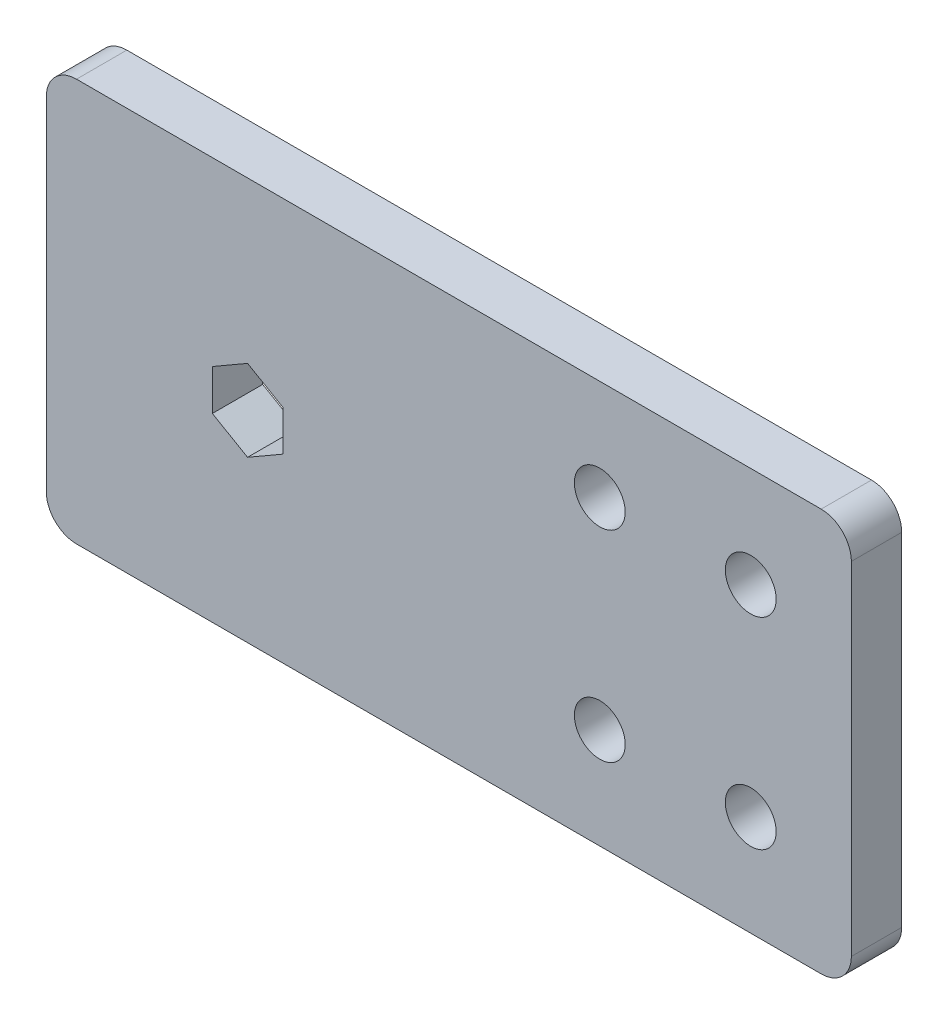
ISO-10303-21;
HEADER;
FILE_DESCRIPTION(('STEP AP214'),'2;1');
FILE_NAME('part.step','',(''),(''),'','','');
FILE_SCHEMA(('AUTOMOTIVE_DESIGN { 1 0 10303 214 1 1 1 1 }'));
ENDSEC;
DATA;
#1=APPLICATION_CONTEXT('core data for automotive mechanical design processes');
#2=APPLICATION_PROTOCOL_DEFINITION('international standard','automotive_design',2000,#1);
#3=PRODUCT_CONTEXT('',#1,'mechanical');
#4=PRODUCT('Part','Part','',(#3));
#5=PRODUCT_RELATED_PRODUCT_CATEGORY('part','',(#4));
#6=PRODUCT_DEFINITION_FORMATION('','',#4);
#7=PRODUCT_DEFINITION_CONTEXT('part definition',#1,'design');
#8=PRODUCT_DEFINITION('design','',#6,#7);
#9=PRODUCT_DEFINITION_SHAPE('','',#8);
#10=(LENGTH_UNIT() NAMED_UNIT(*) SI_UNIT(.MILLI.,.METRE.));
#11=(NAMED_UNIT(*) PLANE_ANGLE_UNIT() SI_UNIT($,.RADIAN.));
#12=(NAMED_UNIT(*) SI_UNIT($,.STERADIAN.) SOLID_ANGLE_UNIT());
#13=UNCERTAINTY_MEASURE_WITH_UNIT(LENGTH_MEASURE(1.E-05),#10,'distance_accuracy_value','');
#14=(GEOMETRIC_REPRESENTATION_CONTEXT(3) GLOBAL_UNCERTAINTY_ASSIGNED_CONTEXT((#13)) GLOBAL_UNIT_ASSIGNED_CONTEXT((#10,
#11,#12)) REPRESENTATION_CONTEXT('',''));
#15=CARTESIAN_POINT('',(0.,0.,0.));
#16=DIRECTION('',(0.,0.,1.));
#17=DIRECTION('',(1.,0.,0.));
#18=AXIS2_PLACEMENT_3D('',#15,#16,#17);
#19=CARTESIAN_POINT('',(80.,-1.11022302462516E-13,5.));
#20=DIRECTION('',(0.,1.,0.));
#21=DIRECTION('',(0.,0.,1.));
#22=AXIS2_PLACEMENT_3D('',#19,#20,#21);
#23=PLANE('',#22);
#24=DIRECTION('',(1.,0.,0.));
#25=VECTOR('',#24,1.);
#26=CARTESIAN_POINT('',(0.,-1.11022302462516E-13,5.));
#27=LINE('',#26,#25);
#28=CARTESIAN_POINT('',(3.,-1.11022302462516E-13,5.));
#29=VERTEX_POINT('',#28);
#30=CARTESIAN_POINT('',(77.,-1.11022302462516E-13,5.));
#31=VERTEX_POINT('',#30);
#32=EDGE_CURVE('E189',#29,#31,#27,.T.);
#33=ORIENTED_EDGE('',*,*,#32,.F.);
#34=DIRECTION('',(0.,0.,-1.));
#35=VECTOR('',#34,1.);
#36=CARTESIAN_POINT('',(3.,-1.11022302462516E-13,5.));
#37=LINE('',#36,#35);
#38=CARTESIAN_POINT('',(3.,0.,0.));
#39=VERTEX_POINT('',#38);
#40=EDGE_CURVE('E226',#29,#39,#37,.T.);
#41=ORIENTED_EDGE('',*,*,#40,.T.);
#42=DIRECTION('',(1.,0.,0.));
#43=VECTOR('',#42,1.);
#44=CARTESIAN_POINT('',(80.,0.,0.));
#45=LINE('',#44,#43);
#46=CARTESIAN_POINT('',(77.,0.,0.));
#47=VERTEX_POINT('',#46);
#48=EDGE_CURVE('E146',#39,#47,#45,.T.);
#49=ORIENTED_EDGE('',*,*,#48,.T.);
#50=DIRECTION('',(0.,0.,-1.));
#51=VECTOR('',#50,1.);
#52=CARTESIAN_POINT('',(77.,-1.11022302462516E-13,5.));
#53=LINE('',#52,#51);
#54=EDGE_CURVE('E216',#47,#31,#53,.F.);
#55=ORIENTED_EDGE('',*,*,#54,.T.);
#56=EDGE_LOOP('',(#33,#41,#49,#55));
#57=FACE_BOUND('',#56,.T.);
#58=ADVANCED_FACE('F32',(#57),#23,.F.);
#59=CARTESIAN_POINT('',(80.0000000000001,39.9999999999999,4.99999999999989));
#60=DIRECTION('',(-1.,0.,0.));
#61=DIRECTION('',(0.,0.,1.));
#62=AXIS2_PLACEMENT_3D('',#59,#60,#61);
#63=PLANE('',#62);
#64=DIRECTION('',(0.,1.,0.));
#65=VECTOR('',#64,1.);
#66=CARTESIAN_POINT('',(80.0000000000001,39.9999999999999,4.99999999999989));
#67=LINE('',#66,#65);
#68=CARTESIAN_POINT('',(80.,2.99999999999989,5.));
#69=VERTEX_POINT('',#68);
#70=CARTESIAN_POINT('',(80.0000000000001,36.9999999999999,5.));
#71=VERTEX_POINT('',#70);
#72=EDGE_CURVE('E191',#69,#71,#67,.T.);
#73=ORIENTED_EDGE('',*,*,#72,.F.);
#74=DIRECTION('',(0.,0.,-1.));
#75=VECTOR('',#74,1.);
#76=CARTESIAN_POINT('',(80.,2.99999999999989,5.));
#77=LINE('',#76,#75);
#78=CARTESIAN_POINT('',(80.,3.,0.));
#79=VERTEX_POINT('',#78);
#80=EDGE_CURVE('E208',#69,#79,#77,.T.);
#81=ORIENTED_EDGE('',*,*,#80,.T.);
#82=DIRECTION('',(0.,1.,0.));
#83=VECTOR('',#82,1.);
#84=CARTESIAN_POINT('',(80.0000000000001,40.,-1.11022302462516E-13));
#85=LINE('',#84,#83);
#86=CARTESIAN_POINT('',(80.0000000000001,37.,0.));
#87=VERTEX_POINT('',#86);
#88=EDGE_CURVE('E201',#79,#87,#85,.T.);
#89=ORIENTED_EDGE('',*,*,#88,.T.);
#90=DIRECTION('',(0.,0.,-1.));
#91=VECTOR('',#90,1.);
#92=CARTESIAN_POINT('',(80.0000000000001,36.9999999999999,5.));
#93=LINE('',#92,#91);
#94=EDGE_CURVE('E199',#87,#71,#93,.F.);
#95=ORIENTED_EDGE('',*,*,#94,.T.);
#96=EDGE_LOOP('',(#73,#81,#89,#95));
#97=FACE_BOUND('',#96,.T.);
#98=ADVANCED_FACE('F264',(#97),#63,.F.);
#99=CARTESIAN_POINT('',(20.,39.9999999999999,4.99999999999989));
#100=DIRECTION('',(0.,-1.,0.));
#101=DIRECTION('',(0.,0.,-1.));
#102=AXIS2_PLACEMENT_3D('',#99,#100,#101);
#103=PLANE('',#102);
#104=DIRECTION('',(-1.,0.,0.));
#105=VECTOR('',#104,1.);
#106=CARTESIAN_POINT('',(20.,40.,-1.11022302462516E-13));
#107=LINE('',#106,#105);
#108=CARTESIAN_POINT('',(77.,40.,-1.11022302462516E-13));
#109=VERTEX_POINT('',#108);
#110=CARTESIAN_POINT('',(3.,40.,-1.11022302462516E-13));
#111=VERTEX_POINT('',#110);
#112=EDGE_CURVE('E204',#109,#111,#107,.T.);
#113=ORIENTED_EDGE('',*,*,#112,.T.);
#114=DIRECTION('',(0.,0.,-1.));
#115=VECTOR('',#114,1.);
#116=CARTESIAN_POINT('',(3.,39.9999999999999,4.99999999999989));
#117=LINE('',#116,#115);
#118=CARTESIAN_POINT('',(3.,39.9999999999999,4.99999999999989));
#119=VERTEX_POINT('',#118);
#120=EDGE_CURVE('E11',#111,#119,#117,.F.);
#121=ORIENTED_EDGE('',*,*,#120,.T.);
#122=DIRECTION('',(-1.,0.,0.));
#123=VECTOR('',#122,1.);
#124=CARTESIAN_POINT('',(20.,39.9999999999999,4.99999999999989));
#125=LINE('',#124,#123);
#126=CARTESIAN_POINT('',(77.,40.,4.99999999999989));
#127=VERTEX_POINT('',#126);
#128=EDGE_CURVE('E195',#127,#119,#125,.T.);
#129=ORIENTED_EDGE('',*,*,#128,.F.);
#130=DIRECTION('',(0.,0.,-1.));
#131=VECTOR('',#130,1.);
#132=CARTESIAN_POINT('',(77.,40.,4.99999999999989));
#133=LINE('',#132,#131);
#134=EDGE_CURVE('E223',#127,#109,#133,.T.);
#135=ORIENTED_EDGE('',*,*,#134,.T.);
#136=EDGE_LOOP('',(#113,#121,#129,#135));
#137=FACE_BOUND('',#136,.T.);
#138=ADVANCED_FACE('F255',(#137),#103,.F.);
#139=CARTESIAN_POINT('',(0.,19.9999999999999,5.));
#140=DIRECTION('',(1.,0.,0.));
#141=DIRECTION('',(0.,0.,-1.));
#142=AXIS2_PLACEMENT_3D('',#139,#140,#141);
#143=PLANE('',#142);
#144=DIRECTION('',(0.,-1.,0.));
#145=VECTOR('',#144,1.);
#146=CARTESIAN_POINT('',(0.,20.,0.));
#147=LINE('',#146,#145);
#148=CARTESIAN_POINT('',(0.,37.,0.));
#149=VERTEX_POINT('',#148);
#150=CARTESIAN_POINT('',(0.,3.,0.));
#151=VERTEX_POINT('',#150);
#152=EDGE_CURVE('E192',#149,#151,#147,.T.);
#153=ORIENTED_EDGE('',*,*,#152,.T.);
#154=DIRECTION('',(0.,0.,-1.));
#155=VECTOR('',#154,1.);
#156=CARTESIAN_POINT('',(0.,2.99999999999989,5.));
#157=LINE('',#156,#155);
#158=CARTESIAN_POINT('',(0.,2.99999999999989,5.));
#159=VERTEX_POINT('',#158);
#160=EDGE_CURVE('E53',#151,#159,#157,.F.);
#161=ORIENTED_EDGE('',*,*,#160,.T.);
#162=DIRECTION('',(0.,-1.,0.));
#163=VECTOR('',#162,1.);
#164=CARTESIAN_POINT('',(0.,39.9999999999999,4.99999999999989));
#165=LINE('',#164,#163);
#166=CARTESIAN_POINT('',(0.,36.9999999999999,5.));
#167=VERTEX_POINT('',#166);
#168=EDGE_CURVE('E197',#167,#159,#165,.T.);
#169=ORIENTED_EDGE('',*,*,#168,.F.);
#170=DIRECTION('',(0.,0.,-1.));
#171=VECTOR('',#170,1.);
#172=CARTESIAN_POINT('',(0.,36.9999999999999,5.));
#173=LINE('',#172,#171);
#174=EDGE_CURVE('E233',#167,#149,#173,.T.);
#175=ORIENTED_EDGE('',*,*,#174,.T.);
#176=EDGE_LOOP('',(#153,#161,#169,#175));
#177=FACE_BOUND('',#176,.T.);
#178=ADVANCED_FACE('F250',(#177),#143,.F.);
#179=CARTESIAN_POINT('',(0.,-1.11022302462516E-13,5.));
#180=DIRECTION('',(0.,0.,-1.));
#181=DIRECTION('',(-1.,0.,0.));
#182=AXIS2_PLACEMENT_3D('',#179,#180,#181);
#183=PLANE('',#182);
#184=CARTESIAN_POINT('',(55.,9.9999999999999,4.99999999999989));
#185=DIRECTION('',(0.,0.,1.));
#186=DIRECTION('',(1.,0.,0.));
#187=AXIS2_PLACEMENT_3D('',#184,#185,#186);
#188=CIRCLE('',#187,2.525);
#189=CARTESIAN_POINT('',(57.525,9.9999999999999,4.99999999999989));
#190=VERTEX_POINT('',#189);
#191=EDGE_CURVE('E343',#190,#190,#188,.T.);
#192=ORIENTED_EDGE('',*,*,#191,.F.);
#193=EDGE_LOOP('',(#192));
#194=FACE_BOUND('',#193,.T.);
#195=CARTESIAN_POINT('',(70.0000000000001,29.9999999999999,5.));
#196=DIRECTION('',(0.,0.,1.));
#197=DIRECTION('',(1.,0.,0.));
#198=AXIS2_PLACEMENT_3D('',#195,#196,#197);
#199=CIRCLE('',#198,2.52499999999999);
#200=CARTESIAN_POINT('',(72.5250000000001,29.9999999999999,5.));
#201=VERTEX_POINT('',#200);
#202=EDGE_CURVE('E339',#201,#201,#199,.T.);
#203=ORIENTED_EDGE('',*,*,#202,.F.);
#204=EDGE_LOOP('',(#203));
#205=FACE_BOUND('',#204,.T.);
#206=CARTESIAN_POINT('',(70.0000000000001,9.9999999999999,4.99999999999989));
#207=DIRECTION('',(0.,0.,1.));
#208=DIRECTION('',(1.,0.,0.));
#209=AXIS2_PLACEMENT_3D('',#206,#207,#208);
#210=CIRCLE('',#209,2.52499999999999);
#211=CARTESIAN_POINT('',(72.5250000000001,9.9999999999999,4.99999999999989));
#212=VERTEX_POINT('',#211);
#213=EDGE_CURVE('E334',#212,#212,#210,.T.);
#214=ORIENTED_EDGE('',*,*,#213,.F.);
#215=EDGE_LOOP('',(#214));
#216=FACE_BOUND('',#215,.T.);
#217=CARTESIAN_POINT('',(55.,29.9999999999999,5.));
#218=DIRECTION('',(0.,0.,1.));
#219=DIRECTION('',(1.,0.,0.));
#220=AXIS2_PLACEMENT_3D('',#217,#218,#219);
#221=CIRCLE('',#220,2.525);
#222=CARTESIAN_POINT('',(57.525,29.9999999999999,5.));
#223=VERTEX_POINT('',#222);
#224=EDGE_CURVE('E352',#223,#223,#221,.T.);
#225=ORIENTED_EDGE('',*,*,#224,.F.);
#226=EDGE_LOOP('',(#225));
#227=FACE_BOUND('',#226,.T.);
#228=DIRECTION('',(0.866025403784438,0.5,0.));
#229=VECTOR('',#228,1.);
#230=CARTESIAN_POINT('',(20.,15.9585481156725,5.));
#231=LINE('',#230,#229);
#232=CARTESIAN_POINT('',(20.,15.9585481156725,5.));
#233=VERTEX_POINT('',#232);
#234=CARTESIAN_POINT('',(23.5,17.9792740578362,5.));
#235=VERTEX_POINT('',#234);
#236=EDGE_CURVE('E163',#233,#235,#231,.T.);
#237=ORIENTED_EDGE('',*,*,#236,.F.);
#238=DIRECTION('',(0.866025403784438,-0.5,0.));
#239=VECTOR('',#238,1.);
#240=CARTESIAN_POINT('',(16.5,17.9792740578362,5.));
#241=LINE('',#240,#239);
#242=CARTESIAN_POINT('',(16.5,17.9792740578362,5.));
#243=VERTEX_POINT('',#242);
#244=EDGE_CURVE('E154',#243,#233,#241,.T.);
#245=ORIENTED_EDGE('',*,*,#244,.F.);
#246=DIRECTION('',(0.,-1.,0.));
#247=VECTOR('',#246,1.);
#248=CARTESIAN_POINT('',(16.5,22.0207259421636,5.));
#249=LINE('',#248,#247);
#250=CARTESIAN_POINT('',(16.5,22.0207259421636,5.));
#251=VERTEX_POINT('',#250);
#252=EDGE_CURVE('E155',#251,#243,#249,.T.);
#253=ORIENTED_EDGE('',*,*,#252,.F.);
#254=DIRECTION('',(-0.866025403784439,-0.5,0.));
#255=VECTOR('',#254,1.);
#256=CARTESIAN_POINT('',(20.,24.0414518843273,4.99999999999989));
#257=LINE('',#256,#255);
#258=CARTESIAN_POINT('',(20.,24.0414518843273,4.99999999999989));
#259=VERTEX_POINT('',#258);
#260=EDGE_CURVE('E176',#259,#251,#257,.T.);
#261=ORIENTED_EDGE('',*,*,#260,.F.);
#262=DIRECTION('',(-0.866025403784439,0.499999999999999,0.));
#263=VECTOR('',#262,1.);
#264=CARTESIAN_POINT('',(23.5,22.0207259421636,5.));
#265=LINE('',#264,#263);
#266=CARTESIAN_POINT('',(23.5,22.0207259421636,5.));
#267=VERTEX_POINT('',#266);
#268=EDGE_CURVE('E173',#267,#259,#265,.T.);
#269=ORIENTED_EDGE('',*,*,#268,.F.);
#270=DIRECTION('',(0.,1.,0.));
#271=VECTOR('',#270,1.);
#272=CARTESIAN_POINT('',(23.5,17.9792740578362,5.));
#273=LINE('',#272,#271);
#274=EDGE_CURVE('E170',#235,#267,#273,.T.);
#275=ORIENTED_EDGE('',*,*,#274,.F.);
#276=EDGE_LOOP('',(#237,#245,#253,#261,#269,#275));
#277=FACE_BOUND('',#276,.T.);
#278=ORIENTED_EDGE('',*,*,#168,.T.);
#279=CARTESIAN_POINT('',(3.,2.99999999999989,5.));
#280=DIRECTION('',(0.,0.,-1.));
#281=DIRECTION('',(-1.,0.,0.));
#282=AXIS2_PLACEMENT_3D('',#279,#280,#281);
#283=CIRCLE('',#282,3.);
#284=EDGE_CURVE('E40',#159,#29,#283,.F.);
#285=ORIENTED_EDGE('',*,*,#284,.T.);
#286=ORIENTED_EDGE('',*,*,#32,.T.);
#287=CARTESIAN_POINT('',(77.,2.99999999999989,5.));
#288=DIRECTION('',(0.,0.,-1.));
#289=DIRECTION('',(-1.,0.,0.));
#290=AXIS2_PLACEMENT_3D('',#287,#288,#289);
#291=CIRCLE('',#290,3.);
#292=EDGE_CURVE('E221',#31,#69,#291,.F.);
#293=ORIENTED_EDGE('',*,*,#292,.T.);
#294=ORIENTED_EDGE('',*,*,#72,.T.);
#295=CARTESIAN_POINT('',(77.,37.,5.));
#296=DIRECTION('',(0.,0.,-1.));
#297=DIRECTION('',(-1.,0.,0.));
#298=AXIS2_PLACEMENT_3D('',#295,#296,#297);
#299=CIRCLE('',#298,3.);
#300=EDGE_CURVE('E219',#71,#127,#299,.F.);
#301=ORIENTED_EDGE('',*,*,#300,.T.);
#302=ORIENTED_EDGE('',*,*,#128,.T.);
#303=CARTESIAN_POINT('',(3.,36.9999999999999,5.));
#304=DIRECTION('',(0.,0.,-1.));
#305=DIRECTION('',(-1.,0.,0.));
#306=AXIS2_PLACEMENT_3D('',#303,#304,#305);
#307=CIRCLE('',#306,3.);
#308=EDGE_CURVE('E237',#119,#167,#307,.F.);
#309=ORIENTED_EDGE('',*,*,#308,.T.);
#310=EDGE_LOOP('',(#278,#285,#286,#293,#294,#301,#302,#309));
#311=FACE_BOUND('',#310,.T.);
#312=ADVANCED_FACE('F241',(#194,#205,#216,#227,#277,#311),#183,.F.);
#313=CARTESIAN_POINT('',(0.,0.,0.));
#314=DIRECTION('',(0.,0.,-1.));
#315=DIRECTION('',(-1.,0.,0.));
#316=AXIS2_PLACEMENT_3D('',#313,#314,#315);
#317=PLANE('',#316);
#318=CARTESIAN_POINT('',(55.,10.,-1.11022302462516E-13));
#319=DIRECTION('',(0.,0.,-1.));
#320=DIRECTION('',(-1.,0.,0.));
#321=AXIS2_PLACEMENT_3D('',#318,#319,#320);
#322=CIRCLE('',#321,2.525);
#323=CARTESIAN_POINT('',(52.4750000000001,10.,-1.11022302462516E-13));
#324=VERTEX_POINT('',#323);
#325=EDGE_CURVE('E347',#324,#324,#322,.F.);
#326=ORIENTED_EDGE('',*,*,#325,.T.);
#327=EDGE_LOOP('',(#326));
#328=FACE_BOUND('',#327,.T.);
#329=CARTESIAN_POINT('',(70.0000000000001,30.,0.));
#330=DIRECTION('',(0.,0.,-1.));
#331=DIRECTION('',(-1.,0.,0.));
#332=AXIS2_PLACEMENT_3D('',#329,#330,#331);
#333=CIRCLE('',#332,2.52499999999999);
#334=CARTESIAN_POINT('',(67.4750000000001,30.,0.));
#335=VERTEX_POINT('',#334);
#336=EDGE_CURVE('E336',#335,#335,#333,.F.);
#337=ORIENTED_EDGE('',*,*,#336,.T.);
#338=EDGE_LOOP('',(#337));
#339=FACE_BOUND('',#338,.T.);
#340=CARTESIAN_POINT('',(70.0000000000001,10.,-1.11022302462516E-13));
#341=DIRECTION('',(0.,0.,-1.));
#342=DIRECTION('',(-1.,0.,0.));
#343=AXIS2_PLACEMENT_3D('',#340,#341,#342);
#344=CIRCLE('',#343,2.52499999999999);
#345=CARTESIAN_POINT('',(67.4750000000001,10.,-1.11022302462516E-13));
#346=VERTEX_POINT('',#345);
#347=EDGE_CURVE('E331',#346,#346,#344,.F.);
#348=ORIENTED_EDGE('',*,*,#347,.T.);
#349=EDGE_LOOP('',(#348));
#350=FACE_BOUND('',#349,.T.);
#351=CARTESIAN_POINT('',(55.,30.,0.));
#352=DIRECTION('',(0.,0.,-1.));
#353=DIRECTION('',(-1.,0.,0.));
#354=AXIS2_PLACEMENT_3D('',#351,#352,#353);
#355=CIRCLE('',#354,2.525);
#356=CARTESIAN_POINT('',(52.4750000000001,30.,0.));
#357=VERTEX_POINT('',#356);
#358=EDGE_CURVE('E346',#357,#357,#355,.F.);
#359=ORIENTED_EDGE('',*,*,#358,.T.);
#360=EDGE_LOOP('',(#359));
#361=FACE_BOUND('',#360,.T.);
#362=DIRECTION('',(0.866025403784439,-0.5,0.));
#363=VECTOR('',#362,1.);
#364=CARTESIAN_POINT('',(16.5,17.9792740578363,0.));
#365=LINE('',#364,#363);
#366=CARTESIAN_POINT('',(16.5,17.9792740578363,0.));
#367=VERTEX_POINT('',#366);
#368=CARTESIAN_POINT('',(20.,15.9585481156726,0.));
#369=VERTEX_POINT('',#368);
#370=EDGE_CURVE('E151',#367,#369,#365,.T.);
#371=ORIENTED_EDGE('',*,*,#370,.T.);
#372=DIRECTION('',(0.866025403784439,0.5,0.));
#373=VECTOR('',#372,1.);
#374=CARTESIAN_POINT('',(20.,15.9585481156726,0.));
#375=LINE('',#374,#373);
#376=CARTESIAN_POINT('',(23.5,17.9792740578363,0.));
#377=VERTEX_POINT('',#376);
#378=EDGE_CURVE('E135',#369,#377,#375,.T.);
#379=ORIENTED_EDGE('',*,*,#378,.T.);
#380=DIRECTION('',(0.,1.,0.));
#381=VECTOR('',#380,1.);
#382=CARTESIAN_POINT('',(23.5,17.9792740578363,0.));
#383=LINE('',#382,#381);
#384=CARTESIAN_POINT('',(23.5,22.0207259421636,0.));
#385=VERTEX_POINT('',#384);
#386=EDGE_CURVE('E355',#377,#385,#383,.T.);
#387=ORIENTED_EDGE('',*,*,#386,.T.);
#388=DIRECTION('',(-0.866025403784439,0.499999999999999,0.));
#389=VECTOR('',#388,1.);
#390=CARTESIAN_POINT('',(23.5,22.0207259421636,0.));
#391=LINE('',#390,#389);
#392=CARTESIAN_POINT('',(20.,24.0414518843274,-1.11022302462516E-13));
#393=VERTEX_POINT('',#392);
#394=EDGE_CURVE('E359',#385,#393,#391,.T.);
#395=ORIENTED_EDGE('',*,*,#394,.T.);
#396=DIRECTION('',(-0.866025403784439,-0.5,0.));
#397=VECTOR('',#396,1.);
#398=CARTESIAN_POINT('',(20.,24.0414518843274,-1.11022302462516E-13));
#399=LINE('',#398,#397);
#400=CARTESIAN_POINT('',(16.5,22.0207259421637,0.));
#401=VERTEX_POINT('',#400);
#402=EDGE_CURVE('E165',#393,#401,#399,.T.);
#403=ORIENTED_EDGE('',*,*,#402,.T.);
#404=DIRECTION('',(0.,-1.,0.));
#405=VECTOR('',#404,1.);
#406=CARTESIAN_POINT('',(16.5,22.0207259421637,0.));
#407=LINE('',#406,#405);
#408=EDGE_CURVE('E161',#401,#367,#407,.T.);
#409=ORIENTED_EDGE('',*,*,#408,.T.);
#410=EDGE_LOOP('',(#371,#379,#387,#395,#403,#409));
#411=FACE_BOUND('',#410,.T.);
#412=ORIENTED_EDGE('',*,*,#48,.F.);
#413=CARTESIAN_POINT('',(3.,3.,0.));
#414=DIRECTION('',(0.,0.,-1.));
#415=DIRECTION('',(-1.,0.,0.));
#416=AXIS2_PLACEMENT_3D('',#413,#414,#415);
#417=CIRCLE('',#416,3.);
#418=EDGE_CURVE('E231',#39,#151,#417,.T.);
#419=ORIENTED_EDGE('',*,*,#418,.T.);
#420=ORIENTED_EDGE('',*,*,#152,.F.);
#421=CARTESIAN_POINT('',(3.,37.,0.));
#422=DIRECTION('',(0.,0.,-1.));
#423=DIRECTION('',(-1.,0.,0.));
#424=AXIS2_PLACEMENT_3D('',#421,#422,#423);
#425=CIRCLE('',#424,3.);
#426=EDGE_CURVE('E229',#149,#111,#425,.T.);
#427=ORIENTED_EDGE('',*,*,#426,.T.);
#428=ORIENTED_EDGE('',*,*,#112,.F.);
#429=CARTESIAN_POINT('',(77.,37.,0.));
#430=DIRECTION('',(0.,0.,-1.));
#431=DIRECTION('',(-1.,0.,0.));
#432=AXIS2_PLACEMENT_3D('',#429,#430,#431);
#433=CIRCLE('',#432,3.);
#434=EDGE_CURVE('E211',#109,#87,#433,.T.);
#435=ORIENTED_EDGE('',*,*,#434,.T.);
#436=ORIENTED_EDGE('',*,*,#88,.F.);
#437=CARTESIAN_POINT('',(77.,3.,0.));
#438=DIRECTION('',(0.,0.,-1.));
#439=DIRECTION('',(-1.,0.,0.));
#440=AXIS2_PLACEMENT_3D('',#437,#438,#439);
#441=CIRCLE('',#440,3.);
#442=EDGE_CURVE('E213',#79,#47,#441,.T.);
#443=ORIENTED_EDGE('',*,*,#442,.T.);
#444=EDGE_LOOP('',(#412,#419,#420,#427,#428,#435,#436,#443));
#445=FACE_BOUND('',#444,.T.);
#446=ADVANCED_FACE('F158',(#328,#339,#350,#361,#411,#445),#317,.T.);
#447=CARTESIAN_POINT('',(16.5,17.9792740578363,-0.00100000000002876));
#448=DIRECTION('',(-0.5,-0.866025403784438,0.));
#449=DIRECTION('',(0.866025403784439,-0.5,0.));
#450=AXIS2_PLACEMENT_3D('',#447,#448,#449);
#451=PLANE('',#450);
#452=DIRECTION('',(0.,0.,1.));
#453=VECTOR('',#452,1.);
#454=CARTESIAN_POINT('',(16.5,17.9792740578363,-0.00100000000002876));
#455=LINE('',#454,#453);
#456=EDGE_CURVE('E147',#367,#243,#455,.T.);
#457=ORIENTED_EDGE('',*,*,#456,.T.);
#458=ORIENTED_EDGE('',*,*,#244,.T.);
#459=DIRECTION('',(0.,0.,1.));
#460=VECTOR('',#459,1.);
#461=CARTESIAN_POINT('',(20.,15.9585481156726,-0.00100000000002876));
#462=LINE('',#461,#460);
#463=EDGE_CURVE('E139',#369,#233,#462,.T.);
#464=ORIENTED_EDGE('',*,*,#463,.F.);
#465=ORIENTED_EDGE('',*,*,#370,.F.);
#466=EDGE_LOOP('',(#457,#458,#464,#465));
#467=FACE_BOUND('',#466,.T.);
#468=ADVANCED_FACE('F150',(#467),#451,.F.);
#469=CARTESIAN_POINT('',(16.5,22.0207259421637,-0.00100000000002876));
#470=DIRECTION('',(-1.,0.,0.));
#471=DIRECTION('',(0.,0.,1.));
#472=AXIS2_PLACEMENT_3D('',#469,#470,#471);
#473=PLANE('',#472);
#474=DIRECTION('',(0.,0.,1.));
#475=VECTOR('',#474,1.);
#476=CARTESIAN_POINT('',(16.5,22.0207259421637,-0.00100000000002876));
#477=LINE('',#476,#475);
#478=EDGE_CURVE('E182',#401,#251,#477,.T.);
#479=ORIENTED_EDGE('',*,*,#478,.T.);
#480=ORIENTED_EDGE('',*,*,#252,.T.);
#481=ORIENTED_EDGE('',*,*,#456,.F.);
#482=ORIENTED_EDGE('',*,*,#408,.F.);
#483=EDGE_LOOP('',(#479,#480,#481,#482));
#484=FACE_BOUND('',#483,.T.);
#485=ADVANCED_FACE('F298',(#484),#473,.F.);
#486=CARTESIAN_POINT('',(20.,24.0414518843274,-0.00100000000008427));
#487=DIRECTION('',(-0.5,0.866025403784439,0.));
#488=DIRECTION('',(-0.866025403784439,-0.5,0.));
#489=AXIS2_PLACEMENT_3D('',#486,#487,#488);
#490=PLANE('',#489);
#491=DIRECTION('',(0.,0.,1.));
#492=VECTOR('',#491,1.);
#493=CARTESIAN_POINT('',(20.,24.0414518843274,-0.00100000000008427));
#494=LINE('',#493,#492);
#495=EDGE_CURVE('E184',#393,#259,#494,.T.);
#496=ORIENTED_EDGE('',*,*,#495,.T.);
#497=ORIENTED_EDGE('',*,*,#260,.T.);
#498=ORIENTED_EDGE('',*,*,#478,.F.);
#499=ORIENTED_EDGE('',*,*,#402,.F.);
#500=EDGE_LOOP('',(#496,#497,#498,#499));
#501=FACE_BOUND('',#500,.T.);
#502=ADVANCED_FACE('F309',(#501),#490,.F.);
#503=CARTESIAN_POINT('',(23.5,22.0207259421636,-0.00100000000002876));
#504=DIRECTION('',(0.499999999999999,0.866025403784439,0.));
#505=DIRECTION('',(-0.866025403784439,0.499999999999999,0.));
#506=AXIS2_PLACEMENT_3D('',#503,#504,#505);
#507=PLANE('',#506);
#508=DIRECTION('',(0.,0.,1.));
#509=VECTOR('',#508,1.);
#510=CARTESIAN_POINT('',(23.5,22.0207259421636,-0.00100000000002876));
#511=LINE('',#510,#509);
#512=EDGE_CURVE('E186',#385,#267,#511,.T.);
#513=ORIENTED_EDGE('',*,*,#512,.T.);
#514=ORIENTED_EDGE('',*,*,#268,.T.);
#515=ORIENTED_EDGE('',*,*,#495,.F.);
#516=ORIENTED_EDGE('',*,*,#394,.F.);
#517=EDGE_LOOP('',(#513,#514,#515,#516));
#518=FACE_BOUND('',#517,.T.);
#519=ADVANCED_FACE('F305',(#518),#507,.F.);
#520=CARTESIAN_POINT('',(23.5,17.9792740578363,-0.00100000000002876));
#521=DIRECTION('',(1.,0.,0.));
#522=DIRECTION('',(0.,0.,-1.));
#523=AXIS2_PLACEMENT_3D('',#520,#521,#522);
#524=PLANE('',#523);
#525=DIRECTION('',(0.,0.,1.));
#526=VECTOR('',#525,1.);
#527=CARTESIAN_POINT('',(23.5,17.9792740578363,-0.00100000000002876));
#528=LINE('',#527,#526);
#529=EDGE_CURVE('E141',#377,#235,#528,.T.);
#530=ORIENTED_EDGE('',*,*,#529,.T.);
#531=ORIENTED_EDGE('',*,*,#274,.T.);
#532=ORIENTED_EDGE('',*,*,#512,.F.);
#533=ORIENTED_EDGE('',*,*,#386,.F.);
#534=EDGE_LOOP('',(#530,#531,#532,#533));
#535=FACE_BOUND('',#534,.T.);
#536=ADVANCED_FACE('F302',(#535),#524,.F.);
#537=CARTESIAN_POINT('',(20.,15.9585481156726,-0.00100000000002876));
#538=DIRECTION('',(0.5,-0.866025403784438,0.));
#539=DIRECTION('',(0.866025403784439,0.5,0.));
#540=AXIS2_PLACEMENT_3D('',#537,#538,#539);
#541=PLANE('',#540);
#542=ORIENTED_EDGE('',*,*,#463,.T.);
#543=ORIENTED_EDGE('',*,*,#236,.T.);
#544=ORIENTED_EDGE('',*,*,#529,.F.);
#545=ORIENTED_EDGE('',*,*,#378,.F.);
#546=EDGE_LOOP('',(#542,#543,#544,#545));
#547=FACE_BOUND('',#546,.T.);
#548=ADVANCED_FACE('F137',(#547),#541,.F.);
#549=CARTESIAN_POINT('',(55.,30.,-0.000999999999973245));
#550=DIRECTION('',(0.,0.,1.));
#551=DIRECTION('',(1.,0.,0.));
#552=AXIS2_PLACEMENT_3D('',#549,#550,#551);
#553=CYLINDRICAL_SURFACE('',#552,2.525);
#554=ORIENTED_EDGE('',*,*,#358,.F.);
#555=EDGE_LOOP('',(#554));
#556=FACE_BOUND('',#555,.T.);
#557=ORIENTED_EDGE('',*,*,#224,.T.);
#558=EDGE_LOOP('',(#557));
#559=FACE_BOUND('',#558,.T.);
#560=ADVANCED_FACE('F301',(#556,#559),#553,.F.);
#561=CARTESIAN_POINT('',(70.0000000000001,10.,-0.00100000000008427));
#562=DIRECTION('',(0.,0.,1.));
#563=DIRECTION('',(1.,0.,0.));
#564=AXIS2_PLACEMENT_3D('',#561,#562,#563);
#565=CYLINDRICAL_SURFACE('',#564,2.52499999999999);
#566=ORIENTED_EDGE('',*,*,#347,.F.);
#567=EDGE_LOOP('',(#566));
#568=FACE_BOUND('',#567,.T.);
#569=ORIENTED_EDGE('',*,*,#213,.T.);
#570=EDGE_LOOP('',(#569));
#571=FACE_BOUND('',#570,.T.);
#572=ADVANCED_FACE('F319',(#568,#571),#565,.F.);
#573=CARTESIAN_POINT('',(70.0000000000001,30.,-0.000999999999973245));
#574=DIRECTION('',(0.,0.,1.));
#575=DIRECTION('',(1.,0.,0.));
#576=AXIS2_PLACEMENT_3D('',#573,#574,#575);
#577=CYLINDRICAL_SURFACE('',#576,2.52499999999999);
#578=ORIENTED_EDGE('',*,*,#336,.F.);
#579=EDGE_LOOP('',(#578));
#580=FACE_BOUND('',#579,.T.);
#581=ORIENTED_EDGE('',*,*,#202,.T.);
#582=EDGE_LOOP('',(#581));
#583=FACE_BOUND('',#582,.T.);
#584=ADVANCED_FACE('F276',(#580,#583),#577,.F.);
#585=CARTESIAN_POINT('',(55.,10.,-0.00100000000008427));
#586=DIRECTION('',(0.,0.,1.));
#587=DIRECTION('',(1.,0.,0.));
#588=AXIS2_PLACEMENT_3D('',#585,#586,#587);
#589=CYLINDRICAL_SURFACE('',#588,2.525);
#590=ORIENTED_EDGE('',*,*,#325,.F.);
#591=EDGE_LOOP('',(#590));
#592=FACE_BOUND('',#591,.T.);
#593=ORIENTED_EDGE('',*,*,#191,.T.);
#594=EDGE_LOOP('',(#593));
#595=FACE_BOUND('',#594,.T.);
#596=ADVANCED_FACE('F269',(#592,#595),#589,.F.);
#597=CARTESIAN_POINT('',(77.,2.99999999999989,5.));
#598=DIRECTION('',(0.,0.,-1.));
#599=DIRECTION('',(-1.,0.,0.));
#600=AXIS2_PLACEMENT_3D('',#597,#598,#599);
#601=CYLINDRICAL_SURFACE('',#600,3.);
#602=ORIENTED_EDGE('',*,*,#292,.F.);
#603=ORIENTED_EDGE('',*,*,#54,.F.);
#604=ORIENTED_EDGE('',*,*,#442,.F.);
#605=ORIENTED_EDGE('',*,*,#80,.F.);
#606=EDGE_LOOP('',(#602,#603,#604,#605));
#607=FACE_BOUND('',#606,.T.);
#608=ADVANCED_FACE('F267',(#607),#601,.T.);
#609=CARTESIAN_POINT('',(77.,37.,5.));
#610=DIRECTION('',(0.,0.,-1.));
#611=DIRECTION('',(-1.,0.,0.));
#612=AXIS2_PLACEMENT_3D('',#609,#610,#611);
#613=CYLINDRICAL_SURFACE('',#612,3.);
#614=ORIENTED_EDGE('',*,*,#300,.F.);
#615=ORIENTED_EDGE('',*,*,#94,.F.);
#616=ORIENTED_EDGE('',*,*,#434,.F.);
#617=ORIENTED_EDGE('',*,*,#134,.F.);
#618=EDGE_LOOP('',(#614,#615,#616,#617));
#619=FACE_BOUND('',#618,.T.);
#620=ADVANCED_FACE('F259',(#619),#613,.T.);
#621=CARTESIAN_POINT('',(3.,2.99999999999989,5.));
#622=DIRECTION('',(0.,0.,-1.));
#623=DIRECTION('',(-1.,0.,0.));
#624=AXIS2_PLACEMENT_3D('',#621,#622,#623);
#625=CYLINDRICAL_SURFACE('',#624,3.);
#626=ORIENTED_EDGE('',*,*,#284,.F.);
#627=ORIENTED_EDGE('',*,*,#160,.F.);
#628=ORIENTED_EDGE('',*,*,#418,.F.);
#629=ORIENTED_EDGE('',*,*,#40,.F.);
#630=EDGE_LOOP('',(#626,#627,#628,#629));
#631=FACE_BOUND('',#630,.T.);
#632=ADVANCED_FACE('F248',(#631),#625,.T.);
#633=CARTESIAN_POINT('',(3.,36.9999999999999,5.));
#634=DIRECTION('',(0.,0.,-1.));
#635=DIRECTION('',(-1.,0.,0.));
#636=AXIS2_PLACEMENT_3D('',#633,#634,#635);
#637=CYLINDRICAL_SURFACE('',#636,3.);
#638=ORIENTED_EDGE('',*,*,#308,.F.);
#639=ORIENTED_EDGE('',*,*,#120,.F.);
#640=ORIENTED_EDGE('',*,*,#426,.F.);
#641=ORIENTED_EDGE('',*,*,#174,.F.);
#642=EDGE_LOOP('',(#638,#639,#640,#641));
#643=FACE_BOUND('',#642,.T.);
#644=ADVANCED_FACE('F34',(#643),#637,.T.);
#645=CLOSED_SHELL('',(#58,#98,#138,#178,#312,#446,#468,#485,#502,#519,#536,#548,#560,#572,#584,
#596,#608,#620,#632,#644));
#646=MANIFOLD_SOLID_BREP('B2',#645);
#647=ADVANCED_BREP_SHAPE_REPRESENTATION('',(#18,#646),#14);
#648=SHAPE_DEFINITION_REPRESENTATION(#9,#647);
ENDSEC;
END-ISO-10303-21;
